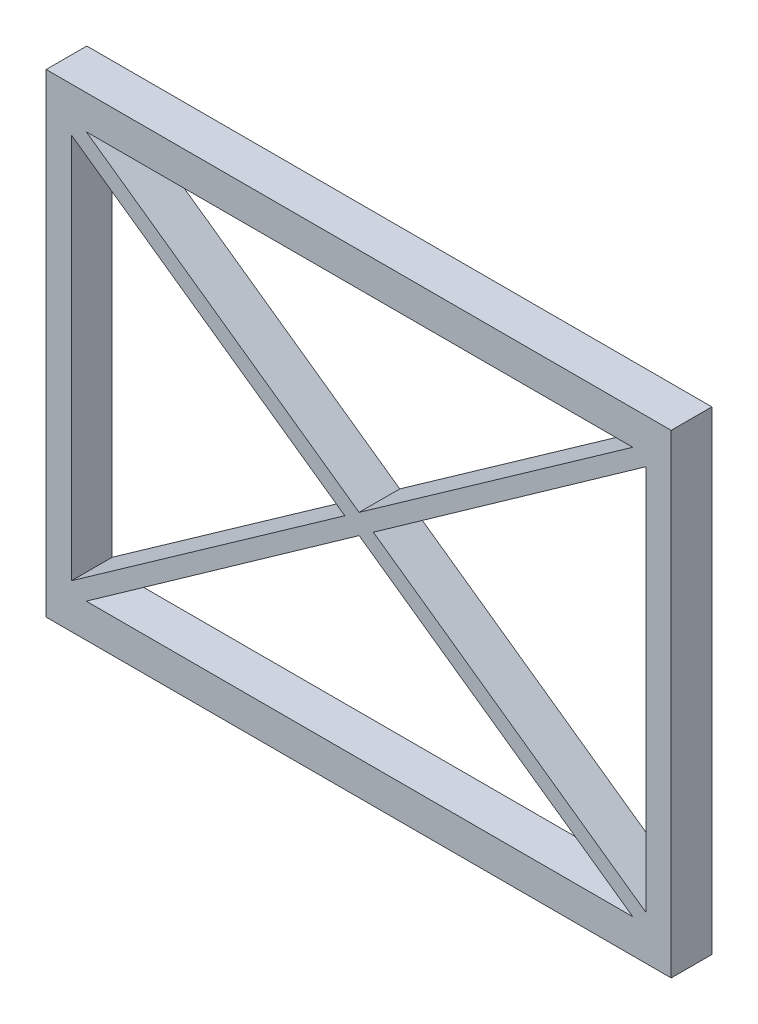
ISO-10303-21;
HEADER;
FILE_DESCRIPTION(('STEP AP214'),'2;1');
FILE_NAME('part.step','',(''),(''),'','','');
FILE_SCHEMA(('AUTOMOTIVE_DESIGN { 1 0 10303 214 1 1 1 1 }'));
ENDSEC;
DATA;
#1=APPLICATION_CONTEXT('core data for automotive mechanical design processes');
#2=APPLICATION_PROTOCOL_DEFINITION('international standard','automotive_design',2000,#1);
#3=PRODUCT_CONTEXT('',#1,'mechanical');
#4=PRODUCT('Part','Part','',(#3));
#5=PRODUCT_RELATED_PRODUCT_CATEGORY('part','',(#4));
#6=PRODUCT_DEFINITION_FORMATION('','',#4);
#7=PRODUCT_DEFINITION_CONTEXT('part definition',#1,'design');
#8=PRODUCT_DEFINITION('design','',#6,#7);
#9=PRODUCT_DEFINITION_SHAPE('','',#8);
#10=(LENGTH_UNIT() NAMED_UNIT(*) SI_UNIT(.MILLI.,.METRE.));
#11=(NAMED_UNIT(*) PLANE_ANGLE_UNIT() SI_UNIT($,.RADIAN.));
#12=(NAMED_UNIT(*) SI_UNIT($,.STERADIAN.) SOLID_ANGLE_UNIT());
#13=UNCERTAINTY_MEASURE_WITH_UNIT(LENGTH_MEASURE(1.E-05),#10,'distance_accuracy_value','');
#14=(GEOMETRIC_REPRESENTATION_CONTEXT(3) GLOBAL_UNCERTAINTY_ASSIGNED_CONTEXT((#13)) GLOBAL_UNIT_ASSIGNED_CONTEXT((#10,
#11,#12)) REPRESENTATION_CONTEXT('',''));
#15=CARTESIAN_POINT('',(0.,0.,0.));
#16=DIRECTION('',(0.,0.,1.));
#17=DIRECTION('',(1.,0.,0.));
#18=AXIS2_PLACEMENT_3D('',#15,#16,#17);
#19=CARTESIAN_POINT('',(-0.934684684684685,56.,2.7027027027027));
#20=DIRECTION('',(0.,0.,-1.));
#21=DIRECTION('',(-1.,0.,0.));
#22=AXIS2_PLACEMENT_3D('',#19,#20,#21);
#23=PLANE('',#22);
#24=DIRECTION('',(-0.816967863264761,-0.576683197598656,0.));
#25=VECTOR('',#24,1.);
#26=CARTESIAN_POINT('',(-1.77436124516122,2.51367843064506,2.7027027027027));
#27=LINE('',#26,#25);
#28=CARTESIAN_POINT('',(34.3312609780916,28.,2.7027027027027));
#29=VERTEX_POINT('',#28);
#30=CARTESIAN_POINT('',(2.06531531531532,5.22403835568732,2.7027027027027));
#31=VERTEX_POINT('',#30);
#32=EDGE_CURVE('E131',#29,#31,#27,.T.);
#33=ORIENTED_EDGE('',*,*,#32,.T.);
#34=DIRECTION('',(0.,-1.,0.));
#35=VECTOR('',#34,1.);
#36=CARTESIAN_POINT('',(2.06531531531532,0.,2.7027027027027));
#37=LINE('',#36,#35);
#38=CARTESIAN_POINT('',(2.06531531531531,50.7759616443127,2.7027027027027));
#39=VERTEX_POINT('',#38);
#40=EDGE_CURVE('E267',#39,#31,#37,.T.);
#41=ORIENTED_EDGE('',*,*,#40,.F.);
#42=DIRECTION('',(0.816967863264761,-0.576683197598656,0.));
#43=VECTOR('',#42,1.);
#44=CARTESIAN_POINT('',(24.6090105793192,34.8627649873688,2.7027027027027));
#45=LINE('',#44,#43);
#46=EDGE_CURVE('E264',#39,#29,#45,.T.);
#47=ORIENTED_EDGE('',*,*,#46,.T.);
#48=EDGE_LOOP('',(#33,#41,#47));
#49=FACE_BOUND('',#48,.T.);
#50=DIRECTION('',(0.816145369634003,-0.577846636768768,0.));
#51=VECTOR('',#50,1.);
#52=CARTESIAN_POINT('',(25.7921916798973,36.4286585277545,2.7027027027027));
#53=LINE('',#52,#51);
#54=CARTESIAN_POINT('',(37.6967528418683,28.,2.7027027027027));
#55=VERTEX_POINT('',#54);
#56=CARTESIAN_POINT('',(69.8653153153153,5.22403835568738,2.7027027027027));
#57=VERTEX_POINT('',#56);
#58=EDGE_CURVE('E238',#55,#57,#53,.T.);
#59=ORIENTED_EDGE('',*,*,#58,.F.);
#60=DIRECTION('',(-0.816145369634002,-0.577846636768769,0.));
#61=VECTOR('',#60,1.);
#62=CARTESIAN_POINT('',(-0.617792309717707,0.872564277246743,2.7027027027027));
#63=LINE('',#62,#61);
#64=CARTESIAN_POINT('',(69.8653153153153,50.7759616443126,2.7027027027027));
#65=VERTEX_POINT('',#64);
#66=EDGE_CURVE('E242',#65,#55,#63,.T.);
#67=ORIENTED_EDGE('',*,*,#66,.F.);
#68=DIRECTION('',(0.,-1.,0.));
#69=VECTOR('',#68,1.);
#70=CARTESIAN_POINT('',(69.8653153153153,0.,2.7027027027027));
#71=LINE('',#70,#69);
#72=EDGE_CURVE('E227',#65,#57,#71,.T.);
#73=ORIENTED_EDGE('',*,*,#72,.T.);
#74=EDGE_LOOP('',(#59,#67,#73));
#75=FACE_BOUND('',#74,.T.);
#76=DIRECTION('',(1.,0.,0.));
#77=VECTOR('',#76,1.);
#78=CARTESIAN_POINT('',(-0.934684684684685,0.,2.7027027027027));
#79=LINE('',#78,#77);
#80=CARTESIAN_POINT('',(-0.934684684684685,0.,2.7027027027027));
#81=VERTEX_POINT('',#80);
#82=CARTESIAN_POINT('',(72.8653153153153,0.,2.7027027027027));
#83=VERTEX_POINT('',#82);
#84=EDGE_CURVE('E306',#81,#83,#79,.T.);
#85=ORIENTED_EDGE('',*,*,#84,.T.);
#86=DIRECTION('',(0.,-1.,0.));
#87=VECTOR('',#86,1.);
#88=CARTESIAN_POINT('',(72.8653153153153,56.,2.7027027027027));
#89=LINE('',#88,#87);
#90=CARTESIAN_POINT('',(72.8653153153153,56.,2.7027027027027));
#91=VERTEX_POINT('',#90);
#92=EDGE_CURVE('E316',#91,#83,#89,.T.);
#93=ORIENTED_EDGE('',*,*,#92,.F.);
#94=DIRECTION('',(1.,0.,0.));
#95=VECTOR('',#94,1.);
#96=CARTESIAN_POINT('',(-0.934684684684685,56.,2.7027027027027));
#97=LINE('',#96,#95);
#98=CARTESIAN_POINT('',(-0.934684684684685,56.,2.7027027027027));
#99=VERTEX_POINT('',#98);
#100=EDGE_CURVE('E296',#99,#91,#97,.T.);
#101=ORIENTED_EDGE('',*,*,#100,.F.);
#102=DIRECTION('',(0.,-1.,0.));
#103=VECTOR('',#102,1.);
#104=CARTESIAN_POINT('',(-0.934684684684685,56.,2.7027027027027));
#105=LINE('',#104,#103);
#106=EDGE_CURVE('E319',#99,#81,#105,.T.);
#107=ORIENTED_EDGE('',*,*,#106,.T.);
#108=EDGE_LOOP('',(#85,#93,#101,#107));
#109=FACE_BOUND('',#108,.T.);
#110=DIRECTION('',(-0.816967863264762,-0.576683197598655,0.));
#111=VECTOR('',#110,1.);
#112=CARTESIAN_POINT('',(-1.77436124516123,2.51367843064507,2.7027027027027));
#113=LINE('',#112,#111);
#114=CARTESIAN_POINT('',(68.3312609780916,52.,2.7027027027027));
#115=VERTEX_POINT('',#114);
#116=CARTESIAN_POINT('',(36.016550130537,29.1896158723144,2.7027027027027));
#117=VERTEX_POINT('',#116);
#118=EDGE_CURVE('E273',#115,#117,#113,.T.);
#119=ORIENTED_EDGE('',*,*,#118,.T.);
#120=DIRECTION('',(0.816145369634003,-0.577846636768769,0.));
#121=VECTOR('',#120,1.);
#122=CARTESIAN_POINT('',(25.7921916798973,36.4286585277545,2.7027027027027));
#123=LINE('',#122,#121);
#124=CARTESIAN_POINT('',(3.79936965253904,52.,2.7027027027027));
#125=VERTEX_POINT('',#124);
#126=EDGE_CURVE('E282',#125,#117,#123,.T.);
#127=ORIENTED_EDGE('',*,*,#126,.F.);
#128=DIRECTION('',(1.,0.,0.));
#129=VECTOR('',#128,1.);
#130=CARTESIAN_POINT('',(0.,52.,2.7027027027027));
#131=LINE('',#130,#129);
#132=EDGE_CURVE('E279',#125,#115,#131,.T.);
#133=ORIENTED_EDGE('',*,*,#132,.T.);
#134=EDGE_LOOP('',(#119,#127,#133));
#135=FACE_BOUND('',#134,.T.);
#136=DIRECTION('',(0.816967863264761,-0.576683197598656,0.));
#137=VECTOR('',#136,1.);
#138=CARTESIAN_POINT('',(24.6090105793192,34.8627649873688,2.7027027027027));
#139=LINE('',#138,#137);
#140=CARTESIAN_POINT('',(36.016550130537,26.8103841276856,2.7027027027027));
#141=VERTEX_POINT('',#140);
#142=CARTESIAN_POINT('',(68.3312609780915,4.,2.7027027027027));
#143=VERTEX_POINT('',#142);
#144=EDGE_CURVE('E123',#141,#143,#139,.T.);
#145=ORIENTED_EDGE('',*,*,#144,.T.);
#146=DIRECTION('',(1.,0.,0.));
#147=VECTOR('',#146,1.);
#148=CARTESIAN_POINT('',(0.,4.,2.7027027027027));
#149=LINE('',#148,#147);
#150=CARTESIAN_POINT('',(3.79936965253905,4.,2.7027027027027));
#151=VERTEX_POINT('',#150);
#152=EDGE_CURVE('E254',#151,#143,#149,.T.);
#153=ORIENTED_EDGE('',*,*,#152,.F.);
#154=DIRECTION('',(-0.816145369634003,-0.577846636768768,0.));
#155=VECTOR('',#154,1.);
#156=CARTESIAN_POINT('',(-0.617792309717732,0.87256427724678,2.7027027027027));
#157=LINE('',#156,#155);
#158=EDGE_CURVE('E251',#141,#151,#157,.T.);
#159=ORIENTED_EDGE('',*,*,#158,.F.);
#160=EDGE_LOOP('',(#145,#153,#159));
#161=FACE_BOUND('',#160,.T.);
#162=ADVANCED_FACE('F108',(#49,#75,#109,#135,#161),#23,.F.);
#163=CARTESIAN_POINT('',(-0.934684684684685,56.,-2.0972972972973));
#164=DIRECTION('',(0.,0.,1.));
#165=DIRECTION('',(1.,0.,0.));
#166=AXIS2_PLACEMENT_3D('',#163,#164,#165);
#167=PLANE('',#166);
#168=DIRECTION('',(-0.816967863264761,-0.576683197598656,0.));
#169=VECTOR('',#168,1.);
#170=CARTESIAN_POINT('',(23.9851679144834,20.6968754845119,-2.0972972972973));
#171=LINE('',#170,#169);
#172=CARTESIAN_POINT('',(34.3312609780916,28.,-2.0972972972973));
#173=VERTEX_POINT('',#172);
#174=CARTESIAN_POINT('',(2.06531531531532,5.22403835568732,-2.0972972972973));
#175=VERTEX_POINT('',#174);
#176=EDGE_CURVE('E340',#173,#175,#171,.T.);
#177=ORIENTED_EDGE('',*,*,#176,.F.);
#178=DIRECTION('',(0.816967863264761,-0.576683197598656,0.));
#179=VECTOR('',#178,1.);
#180=CARTESIAN_POINT('',(-2.39820390999696,53.9266810974743,-2.0972972972973));
#181=LINE('',#180,#179);
#182=CARTESIAN_POINT('',(2.06531531531531,50.7759616443127,-2.0972972972973));
#183=VERTEX_POINT('',#182);
#184=EDGE_CURVE('E335',#183,#173,#181,.T.);
#185=ORIENTED_EDGE('',*,*,#184,.F.);
#186=DIRECTION('',(0.,-1.,0.));
#187=VECTOR('',#186,1.);
#188=CARTESIAN_POINT('',(2.06531531531531,56.,-2.0972972972973));
#189=LINE('',#188,#187);
#190=EDGE_CURVE('E337',#183,#175,#189,.T.);
#191=ORIENTED_EDGE('',*,*,#190,.T.);
#192=EDGE_LOOP('',(#177,#185,#191));
#193=FACE_BOUND('',#192,.T.);
#194=DIRECTION('',(0.,-1.,0.));
#195=VECTOR('',#194,1.);
#196=CARTESIAN_POINT('',(69.8653153153153,56.,-2.0972972972973));
#197=LINE('',#196,#195);
#198=CARTESIAN_POINT('',(69.8653153153153,50.7759616443126,-2.0972972972973));
#199=VERTEX_POINT('',#198);
#200=CARTESIAN_POINT('',(69.8653153153153,5.22403835568738,-2.0972972972973));
#201=VERTEX_POINT('',#200);
#202=EDGE_CURVE('E230',#199,#201,#197,.T.);
#203=ORIENTED_EDGE('',*,*,#202,.F.);
#204=DIRECTION('',(-0.816145369634003,-0.577846636768769,0.));
#205=VECTOR('',#204,1.);
#206=CARTESIAN_POINT('',(25.1696045071144,19.1305377658551,-2.0972972972973));
#207=LINE('',#206,#205);
#208=CARTESIAN_POINT('',(37.6967528418683,28.,-2.0972972972973));
#209=VERTEX_POINT('',#208);
#210=EDGE_CURVE('E332',#199,#209,#207,.T.);
#211=ORIENTED_EDGE('',*,*,#210,.T.);
#212=DIRECTION('',(0.816145369634003,-0.577846636768768,0.));
#213=VECTOR('',#212,1.);
#214=CARTESIAN_POINT('',(-1.24037948250069,55.5682394291436,-2.0972972972973));
#215=LINE('',#214,#213);
#216=EDGE_CURVE('E329',#209,#201,#215,.T.);
#217=ORIENTED_EDGE('',*,*,#216,.T.);
#218=EDGE_LOOP('',(#203,#211,#217));
#219=FACE_BOUND('',#218,.T.);
#220=DIRECTION('',(-1.,0.,0.));
#221=VECTOR('',#220,1.);
#222=CARTESIAN_POINT('',(-0.934684684684685,0.,-2.0972972972973));
#223=LINE('',#222,#221);
#224=CARTESIAN_POINT('',(72.8653153153153,0.,-2.0972972972973));
#225=VERTEX_POINT('',#224);
#226=CARTESIAN_POINT('',(-0.934684684684685,0.,-2.0972972972973));
#227=VERTEX_POINT('',#226);
#228=EDGE_CURVE('E297',#225,#227,#223,.T.);
#229=ORIENTED_EDGE('',*,*,#228,.T.);
#230=DIRECTION('',(0.,-1.,0.));
#231=VECTOR('',#230,1.);
#232=CARTESIAN_POINT('',(-0.934684684684685,56.,-2.0972972972973));
#233=LINE('',#232,#231);
#234=CARTESIAN_POINT('',(-0.934684684684685,56.,-2.0972972972973));
#235=VERTEX_POINT('',#234);
#236=EDGE_CURVE('E303',#235,#227,#233,.T.);
#237=ORIENTED_EDGE('',*,*,#236,.F.);
#238=DIRECTION('',(-1.,0.,0.));
#239=VECTOR('',#238,1.);
#240=CARTESIAN_POINT('',(-0.934684684684685,56.,-2.0972972972973));
#241=LINE('',#240,#239);
#242=CARTESIAN_POINT('',(72.8653153153153,56.,-2.0972972972973));
#243=VERTEX_POINT('',#242);
#244=EDGE_CURVE('E301',#243,#235,#241,.T.);
#245=ORIENTED_EDGE('',*,*,#244,.F.);
#246=DIRECTION('',(0.,-1.,0.));
#247=VECTOR('',#246,1.);
#248=CARTESIAN_POINT('',(72.8653153153153,56.,-2.0972972972973));
#249=LINE('',#248,#247);
#250=EDGE_CURVE('E313',#243,#225,#249,.T.);
#251=ORIENTED_EDGE('',*,*,#250,.T.);
#252=EDGE_LOOP('',(#229,#237,#245,#251));
#253=FACE_BOUND('',#252,.T.);
#254=DIRECTION('',(-0.816967863264762,-0.576683197598655,0.));
#255=VECTOR('',#254,1.);
#256=CARTESIAN_POINT('',(23.9851679144834,20.6968754845119,-2.0972972972973));
#257=LINE('',#256,#255);
#258=CARTESIAN_POINT('',(68.3312609780916,52.,-2.0972972972973));
#259=VERTEX_POINT('',#258);
#260=CARTESIAN_POINT('',(36.016550130537,29.1896158723144,-2.0972972972973));
#261=VERTEX_POINT('',#260);
#262=EDGE_CURVE('E327',#259,#261,#257,.T.);
#263=ORIENTED_EDGE('',*,*,#262,.F.);
#264=DIRECTION('',(1.,0.,0.));
#265=VECTOR('',#264,1.);
#266=CARTESIAN_POINT('',(-0.934684684684685,52.,-2.0972972972973));
#267=LINE('',#266,#265);
#268=CARTESIAN_POINT('',(3.79936965253904,52.,-2.0972972972973));
#269=VERTEX_POINT('',#268);
#270=EDGE_CURVE('E322',#269,#259,#267,.T.);
#271=ORIENTED_EDGE('',*,*,#270,.F.);
#272=DIRECTION('',(0.816145369634003,-0.577846636768769,0.));
#273=VECTOR('',#272,1.);
#274=CARTESIAN_POINT('',(-1.24037948250069,55.5682394291436,-2.0972972972973));
#275=LINE('',#274,#273);
#276=EDGE_CURVE('E324',#269,#261,#275,.T.);
#277=ORIENTED_EDGE('',*,*,#276,.T.);
#278=EDGE_LOOP('',(#263,#271,#277));
#279=FACE_BOUND('',#278,.T.);
#280=DIRECTION('',(0.816967863264761,-0.576683197598656,0.));
#281=VECTOR('',#280,1.);
#282=CARTESIAN_POINT('',(-2.39820390999696,53.9266810974743,-2.0972972972973));
#283=LINE('',#282,#281);
#284=CARTESIAN_POINT('',(36.016550130537,26.8103841276856,-2.0972972972973));
#285=VERTEX_POINT('',#284);
#286=CARTESIAN_POINT('',(68.3312609780915,4.,-2.0972972972973));
#287=VERTEX_POINT('',#286);
#288=EDGE_CURVE('E12',#285,#287,#283,.T.);
#289=ORIENTED_EDGE('',*,*,#288,.F.);
#290=DIRECTION('',(-0.816145369634003,-0.577846636768768,0.));
#291=VECTOR('',#290,1.);
#292=CARTESIAN_POINT('',(25.1696045071144,19.1305377658551,-2.0972972972973));
#293=LINE('',#292,#291);
#294=CARTESIAN_POINT('',(3.79936965253905,4.,-2.0972972972973));
#295=VERTEX_POINT('',#294);
#296=EDGE_CURVE('E342',#285,#295,#293,.T.);
#297=ORIENTED_EDGE('',*,*,#296,.T.);
#298=DIRECTION('',(1.,0.,0.));
#299=VECTOR('',#298,1.);
#300=CARTESIAN_POINT('',(-0.934684684684685,4.,-2.0972972972973));
#301=LINE('',#300,#299);
#302=EDGE_CURVE('E116',#295,#287,#301,.T.);
#303=ORIENTED_EDGE('',*,*,#302,.T.);
#304=EDGE_LOOP('',(#289,#297,#303));
#305=FACE_BOUND('',#304,.T.);
#306=ADVANCED_FACE('F348',(#193,#219,#253,#279,#305),#167,.F.);
#307=CARTESIAN_POINT('',(-0.934684684684685,56.,-2.0972972972973));
#308=DIRECTION('',(1.,0.,0.));
#309=DIRECTION('',(0.,0.,-1.));
#310=AXIS2_PLACEMENT_3D('',#307,#308,#309);
#311=PLANE('',#310);
#312=DIRECTION('',(0.,0.,1.));
#313=VECTOR('',#312,1.);
#314=CARTESIAN_POINT('',(-0.934684684684685,0.,-2.0972972972973));
#315=LINE('',#314,#313);
#316=EDGE_CURVE('E288',#227,#81,#315,.T.);
#317=ORIENTED_EDGE('',*,*,#316,.T.);
#318=ORIENTED_EDGE('',*,*,#106,.F.);
#319=DIRECTION('',(0.,0.,1.));
#320=VECTOR('',#319,1.);
#321=CARTESIAN_POINT('',(-0.934684684684685,56.,-2.0972972972973));
#322=LINE('',#321,#320);
#323=EDGE_CURVE('E293',#235,#99,#322,.T.);
#324=ORIENTED_EDGE('',*,*,#323,.F.);
#325=ORIENTED_EDGE('',*,*,#236,.T.);
#326=EDGE_LOOP('',(#317,#318,#324,#325));
#327=FACE_BOUND('',#326,.T.);
#328=ADVANCED_FACE('F110',(#327),#311,.F.);
#329=CARTESIAN_POINT('',(72.8653153153153,56.,-2.0972972972973));
#330=DIRECTION('',(-1.,0.,0.));
#331=DIRECTION('',(0.,0.,1.));
#332=AXIS2_PLACEMENT_3D('',#329,#330,#331);
#333=PLANE('',#332);
#334=DIRECTION('',(0.,0.,-1.));
#335=VECTOR('',#334,1.);
#336=CARTESIAN_POINT('',(72.8653153153153,0.,-2.0972972972973));
#337=LINE('',#336,#335);
#338=EDGE_CURVE('E308',#83,#225,#337,.T.);
#339=ORIENTED_EDGE('',*,*,#338,.T.);
#340=ORIENTED_EDGE('',*,*,#250,.F.);
#341=DIRECTION('',(0.,0.,-1.));
#342=VECTOR('',#341,1.);
#343=CARTESIAN_POINT('',(72.8653153153153,56.,-2.0972972972973));
#344=LINE('',#343,#342);
#345=EDGE_CURVE('E299',#91,#243,#344,.T.);
#346=ORIENTED_EDGE('',*,*,#345,.F.);
#347=ORIENTED_EDGE('',*,*,#92,.T.);
#348=EDGE_LOOP('',(#339,#340,#346,#347));
#349=FACE_BOUND('',#348,.T.);
#350=ADVANCED_FACE('F366',(#349),#333,.F.);
#351=CARTESIAN_POINT('',(0.,56.,0.));
#352=DIRECTION('',(0.,1.,0.));
#353=DIRECTION('',(0.,0.,1.));
#354=AXIS2_PLACEMENT_3D('',#351,#352,#353);
#355=PLANE('',#354);
#356=ORIENTED_EDGE('',*,*,#323,.T.);
#357=ORIENTED_EDGE('',*,*,#100,.T.);
#358=ORIENTED_EDGE('',*,*,#345,.T.);
#359=ORIENTED_EDGE('',*,*,#244,.T.);
#360=EDGE_LOOP('',(#356,#357,#358,#359));
#361=FACE_BOUND('',#360,.T.);
#362=ADVANCED_FACE('F368',(#361),#355,.T.);
#363=CARTESIAN_POINT('',(0.,0.,0.));
#364=DIRECTION('',(0.,1.,0.));
#365=DIRECTION('',(0.,0.,1.));
#366=AXIS2_PLACEMENT_3D('',#363,#364,#365);
#367=PLANE('',#366);
#368=ORIENTED_EDGE('',*,*,#316,.F.);
#369=ORIENTED_EDGE('',*,*,#228,.F.);
#370=ORIENTED_EDGE('',*,*,#338,.F.);
#371=ORIENTED_EDGE('',*,*,#84,.F.);
#372=EDGE_LOOP('',(#368,#369,#370,#371));
#373=FACE_BOUND('',#372,.T.);
#374=ADVANCED_FACE('F371',(#373),#367,.F.);
#375=CARTESIAN_POINT('',(-1.77436124516123,2.51367843064507,-53.2972972972973));
#376=DIRECTION('',(-0.576683197598655,0.816967863264762,0.));
#377=DIRECTION('',(-0.816967863264762,-0.576683197598655,0.));
#378=AXIS2_PLACEMENT_3D('',#375,#376,#377);
#379=PLANE('',#378);
#380=ORIENTED_EDGE('',*,*,#262,.T.);
#381=DIRECTION('',(0.,0.,1.));
#382=VECTOR('',#381,1.);
#383=CARTESIAN_POINT('',(36.016550130537,29.1896158723144,-53.2972972972973));
#384=LINE('',#383,#382);
#385=EDGE_CURVE('E286',#261,#117,#384,.T.);
#386=ORIENTED_EDGE('',*,*,#385,.T.);
#387=ORIENTED_EDGE('',*,*,#118,.F.);
#388=DIRECTION('',(0.,0.,1.));
#389=VECTOR('',#388,1.);
#390=CARTESIAN_POINT('',(68.3312609780916,52.,-53.2972972972973));
#391=LINE('',#390,#389);
#392=EDGE_CURVE('E285',#259,#115,#391,.T.);
#393=ORIENTED_EDGE('',*,*,#392,.F.);
#394=EDGE_LOOP('',(#380,#386,#387,#393));
#395=FACE_BOUND('',#394,.T.);
#396=ADVANCED_FACE('F374',(#395),#379,.T.);
#397=CARTESIAN_POINT('',(25.7921916798973,36.4286585277545,-53.2972972972973));
#398=DIRECTION('',(-0.577846636768769,-0.816145369634003,0.));
#399=DIRECTION('',(0.816145369634003,-0.577846636768769,0.));
#400=AXIS2_PLACEMENT_3D('',#397,#398,#399);
#401=PLANE('',#400);
#402=DIRECTION('',(0.,0.,1.));
#403=VECTOR('',#402,1.);
#404=CARTESIAN_POINT('',(3.79936965253904,52.,-53.2972972972973));
#405=LINE('',#404,#403);
#406=EDGE_CURVE('E289',#269,#125,#405,.T.);
#407=ORIENTED_EDGE('',*,*,#406,.T.);
#408=ORIENTED_EDGE('',*,*,#126,.T.);
#409=ORIENTED_EDGE('',*,*,#385,.F.);
#410=ORIENTED_EDGE('',*,*,#276,.F.);
#411=EDGE_LOOP('',(#407,#408,#409,#410));
#412=FACE_BOUND('',#411,.T.);
#413=ADVANCED_FACE('F381',(#412),#401,.F.);
#414=CARTESIAN_POINT('',(0.,52.,-53.2972972972973));
#415=DIRECTION('',(0.,-1.,0.));
#416=DIRECTION('',(0.,0.,-1.));
#417=AXIS2_PLACEMENT_3D('',#414,#415,#416);
#418=PLANE('',#417);
#419=ORIENTED_EDGE('',*,*,#270,.T.);
#420=ORIENTED_EDGE('',*,*,#392,.T.);
#421=ORIENTED_EDGE('',*,*,#132,.F.);
#422=ORIENTED_EDGE('',*,*,#406,.F.);
#423=EDGE_LOOP('',(#419,#420,#421,#422));
#424=FACE_BOUND('',#423,.T.);
#425=ADVANCED_FACE('F383',(#424),#418,.T.);
#426=CARTESIAN_POINT('',(-0.617792309717707,0.872564277246743,-53.2972972972973));
#427=DIRECTION('',(-0.577846636768769,0.816145369634003,0.));
#428=DIRECTION('',(-0.816145369634003,-0.577846636768769,0.));
#429=AXIS2_PLACEMENT_3D('',#426,#427,#428);
#430=PLANE('',#429);
#431=DIRECTION('',(0.,0.,1.));
#432=VECTOR('',#431,1.);
#433=CARTESIAN_POINT('',(69.8653153153153,50.7759616443126,-53.2972972972973));
#434=LINE('',#433,#432);
#435=EDGE_CURVE('E233',#199,#65,#434,.T.);
#436=ORIENTED_EDGE('',*,*,#435,.T.);
#437=ORIENTED_EDGE('',*,*,#66,.T.);
#438=DIRECTION('',(0.,0.,1.));
#439=VECTOR('',#438,1.);
#440=CARTESIAN_POINT('',(37.6967528418683,28.,-53.2972972972973));
#441=LINE('',#440,#439);
#442=EDGE_CURVE('E234',#209,#55,#441,.T.);
#443=ORIENTED_EDGE('',*,*,#442,.F.);
#444=ORIENTED_EDGE('',*,*,#210,.F.);
#445=EDGE_LOOP('',(#436,#437,#443,#444));
#446=FACE_BOUND('',#445,.T.);
#447=ADVANCED_FACE('F386',(#446),#430,.F.);
#448=CARTESIAN_POINT('',(69.8653153153153,0.,-53.2972972972973));
#449=DIRECTION('',(-1.,0.,0.));
#450=DIRECTION('',(0.,0.,1.));
#451=AXIS2_PLACEMENT_3D('',#448,#449,#450);
#452=PLANE('',#451);
#453=ORIENTED_EDGE('',*,*,#202,.T.);
#454=DIRECTION('',(0.,0.,1.));
#455=VECTOR('',#454,1.);
#456=CARTESIAN_POINT('',(69.8653153153153,5.22403835568738,-53.2972972972973));
#457=LINE('',#456,#455);
#458=EDGE_CURVE('E222',#201,#57,#457,.T.);
#459=ORIENTED_EDGE('',*,*,#458,.T.);
#460=ORIENTED_EDGE('',*,*,#72,.F.);
#461=ORIENTED_EDGE('',*,*,#435,.F.);
#462=EDGE_LOOP('',(#453,#459,#460,#461));
#463=FACE_BOUND('',#462,.T.);
#464=ADVANCED_FACE('F224',(#463),#452,.T.);
#465=CARTESIAN_POINT('',(25.7921916798973,36.4286585277545,-53.2972972972973));
#466=DIRECTION('',(-0.577846636768768,-0.816145369634003,0.));
#467=DIRECTION('',(0.816145369634003,-0.577846636768768,0.));
#468=AXIS2_PLACEMENT_3D('',#465,#466,#467);
#469=PLANE('',#468);
#470=ORIENTED_EDGE('',*,*,#442,.T.);
#471=ORIENTED_EDGE('',*,*,#58,.T.);
#472=ORIENTED_EDGE('',*,*,#458,.F.);
#473=ORIENTED_EDGE('',*,*,#216,.F.);
#474=EDGE_LOOP('',(#470,#471,#472,#473));
#475=FACE_BOUND('',#474,.T.);
#476=ADVANCED_FACE('F239',(#475),#469,.F.);
#477=CARTESIAN_POINT('',(-1.77436124516122,2.51367843064506,-53.2972972972973));
#478=DIRECTION('',(-0.576683197598656,0.816967863264761,0.));
#479=DIRECTION('',(-0.816967863264761,-0.576683197598656,0.));
#480=AXIS2_PLACEMENT_3D('',#477,#478,#479);
#481=PLANE('',#480);
#482=ORIENTED_EDGE('',*,*,#176,.T.);
#483=DIRECTION('',(0.,0.,1.));
#484=VECTOR('',#483,1.);
#485=CARTESIAN_POINT('',(2.06531531531532,5.22403835568732,-53.2972972972973));
#486=LINE('',#485,#484);
#487=EDGE_CURVE('E271',#175,#31,#486,.T.);
#488=ORIENTED_EDGE('',*,*,#487,.T.);
#489=ORIENTED_EDGE('',*,*,#32,.F.);
#490=DIRECTION('',(0.,0.,1.));
#491=VECTOR('',#490,1.);
#492=CARTESIAN_POINT('',(34.3312609780916,28.,-53.2972972972973));
#493=LINE('',#492,#491);
#494=EDGE_CURVE('E270',#173,#29,#493,.T.);
#495=ORIENTED_EDGE('',*,*,#494,.F.);
#496=EDGE_LOOP('',(#482,#488,#489,#495));
#497=FACE_BOUND('',#496,.T.);
#498=ADVANCED_FACE('F391',(#497),#481,.T.);
#499=CARTESIAN_POINT('',(2.06531531531532,0.,-53.2972972972973));
#500=DIRECTION('',(-1.,0.,0.));
#501=DIRECTION('',(0.,-1.,0.));
#502=AXIS2_PLACEMENT_3D('',#499,#500,#501);
#503=PLANE('',#502);
#504=DIRECTION('',(0.,0.,1.));
#505=VECTOR('',#504,1.);
#506=CARTESIAN_POINT('',(2.06531531531531,50.7759616443127,-53.2972972972973));
#507=LINE('',#506,#505);
#508=EDGE_CURVE('E274',#183,#39,#507,.T.);
#509=ORIENTED_EDGE('',*,*,#508,.T.);
#510=ORIENTED_EDGE('',*,*,#40,.T.);
#511=ORIENTED_EDGE('',*,*,#487,.F.);
#512=ORIENTED_EDGE('',*,*,#190,.F.);
#513=EDGE_LOOP('',(#509,#510,#511,#512));
#514=FACE_BOUND('',#513,.T.);
#515=ADVANCED_FACE('F394',(#514),#503,.F.);
#516=CARTESIAN_POINT('',(24.6090105793192,34.8627649873688,-53.2972972972973));
#517=DIRECTION('',(-0.576683197598656,-0.816967863264761,0.));
#518=DIRECTION('',(0.816967863264761,-0.576683197598656,0.));
#519=AXIS2_PLACEMENT_3D('',#516,#517,#518);
#520=PLANE('',#519);
#521=ORIENTED_EDGE('',*,*,#184,.T.);
#522=ORIENTED_EDGE('',*,*,#494,.T.);
#523=ORIENTED_EDGE('',*,*,#46,.F.);
#524=ORIENTED_EDGE('',*,*,#508,.F.);
#525=EDGE_LOOP('',(#521,#522,#523,#524));
#526=FACE_BOUND('',#525,.T.);
#527=ADVANCED_FACE('F395',(#526),#520,.T.);
#528=CARTESIAN_POINT('',(24.6090105793192,34.8627649873688,-53.2972972972973));
#529=DIRECTION('',(-0.576683197598656,-0.816967863264761,0.));
#530=DIRECTION('',(0.816967863264761,-0.576683197598656,0.));
#531=AXIS2_PLACEMENT_3D('',#528,#529,#530);
#532=PLANE('',#531);
#533=ORIENTED_EDGE('',*,*,#288,.T.);
#534=DIRECTION('',(0.,0.,1.));
#535=VECTOR('',#534,1.);
#536=CARTESIAN_POINT('',(68.3312609780915,4.,-53.2972972972973));
#537=LINE('',#536,#535);
#538=EDGE_CURVE('E258',#287,#143,#537,.T.);
#539=ORIENTED_EDGE('',*,*,#538,.T.);
#540=ORIENTED_EDGE('',*,*,#144,.F.);
#541=DIRECTION('',(0.,0.,1.));
#542=VECTOR('',#541,1.);
#543=CARTESIAN_POINT('',(36.016550130537,26.8103841276856,-53.2972972972973));
#544=LINE('',#543,#542);
#545=EDGE_CURVE('E257',#285,#141,#544,.T.);
#546=ORIENTED_EDGE('',*,*,#545,.F.);
#547=EDGE_LOOP('',(#533,#539,#540,#546));
#548=FACE_BOUND('',#547,.T.);
#549=ADVANCED_FACE('F353',(#548),#532,.T.);
#550=CARTESIAN_POINT('',(0.,4.,-53.2972972972973));
#551=DIRECTION('',(0.,-1.,0.));
#552=DIRECTION('',(0.,0.,-1.));
#553=AXIS2_PLACEMENT_3D('',#550,#551,#552);
#554=PLANE('',#553);
#555=DIRECTION('',(0.,0.,1.));
#556=VECTOR('',#555,1.);
#557=CARTESIAN_POINT('',(3.79936965253905,4.,-53.2972972972973));
#558=LINE('',#557,#556);
#559=EDGE_CURVE('E260',#295,#151,#558,.T.);
#560=ORIENTED_EDGE('',*,*,#559,.T.);
#561=ORIENTED_EDGE('',*,*,#152,.T.);
#562=ORIENTED_EDGE('',*,*,#538,.F.);
#563=ORIENTED_EDGE('',*,*,#302,.F.);
#564=EDGE_LOOP('',(#560,#561,#562,#563));
#565=FACE_BOUND('',#564,.T.);
#566=ADVANCED_FACE('F351',(#565),#554,.F.);
#567=CARTESIAN_POINT('',(-0.617792309717732,0.87256427724678,-53.2972972972973));
#568=DIRECTION('',(-0.577846636768768,0.816145369634003,0.));
#569=DIRECTION('',(-0.816145369634003,-0.577846636768768,0.));
#570=AXIS2_PLACEMENT_3D('',#567,#568,#569);
#571=PLANE('',#570);
#572=ORIENTED_EDGE('',*,*,#545,.T.);
#573=ORIENTED_EDGE('',*,*,#158,.T.);
#574=ORIENTED_EDGE('',*,*,#559,.F.);
#575=ORIENTED_EDGE('',*,*,#296,.F.);
#576=EDGE_LOOP('',(#572,#573,#574,#575));
#577=FACE_BOUND('',#576,.T.);
#578=ADVANCED_FACE('F356',(#577),#571,.F.);
#579=CLOSED_SHELL('',(#162,#306,#328,#350,#362,#374,#396,#413,#425,#447,#464,#476,#498,#515,
#527,#549,#566,#578));
#580=MANIFOLD_SOLID_BREP('B2',#579);
#581=ADVANCED_BREP_SHAPE_REPRESENTATION('',(#18,#580),#14);
#582=SHAPE_DEFINITION_REPRESENTATION(#9,#581);
ENDSEC;
END-ISO-10303-21;
